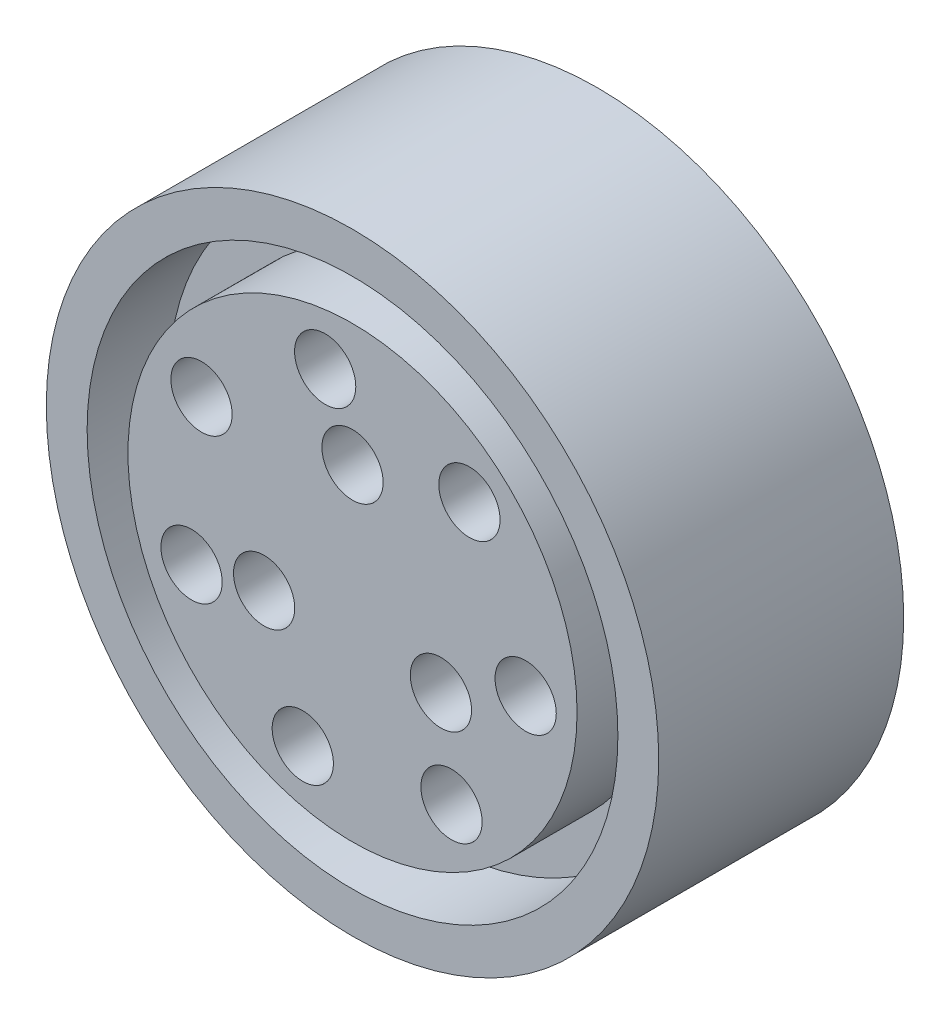
ISO-10303-21;
HEADER;
FILE_DESCRIPTION(('STEP AP214'),'2;1');
FILE_NAME('part.step','',(''),(''),'','','');
FILE_SCHEMA(('AUTOMOTIVE_DESIGN { 1 0 10303 214 1 1 1 1 }'));
ENDSEC;
DATA;
#1=APPLICATION_CONTEXT('core data for automotive mechanical design processes');
#2=APPLICATION_PROTOCOL_DEFINITION('international standard','automotive_design',2000,#1);
#3=PRODUCT_CONTEXT('',#1,'mechanical');
#4=PRODUCT('Part','Part','',(#3));
#5=PRODUCT_RELATED_PRODUCT_CATEGORY('part','',(#4));
#6=PRODUCT_DEFINITION_FORMATION('','',#4);
#7=PRODUCT_DEFINITION_CONTEXT('part definition',#1,'design');
#8=PRODUCT_DEFINITION('design','',#6,#7);
#9=PRODUCT_DEFINITION_SHAPE('','',#8);
#10=(LENGTH_UNIT() NAMED_UNIT(*) SI_UNIT(.MILLI.,.METRE.));
#11=(NAMED_UNIT(*) PLANE_ANGLE_UNIT() SI_UNIT($,.RADIAN.));
#12=(NAMED_UNIT(*) SI_UNIT($,.STERADIAN.) SOLID_ANGLE_UNIT());
#13=UNCERTAINTY_MEASURE_WITH_UNIT(LENGTH_MEASURE(1.E-05),#10,'distance_accuracy_value','');
#14=(GEOMETRIC_REPRESENTATION_CONTEXT(3) GLOBAL_UNCERTAINTY_ASSIGNED_CONTEXT((#13)) GLOBAL_UNIT_ASSIGNED_CONTEXT((#10,
#11,#12)) REPRESENTATION_CONTEXT('',''));
#15=CARTESIAN_POINT('',(0.,0.,0.));
#16=DIRECTION('',(0.,0.,1.));
#17=DIRECTION('',(1.,0.,0.));
#18=AXIS2_PLACEMENT_3D('',#15,#16,#17);
#19=CARTESIAN_POINT('',(-17.8440625583821,-1.91614094586654,6.));
#20=DIRECTION('',(0.,0.,-1.));
#21=DIRECTION('',(-1.,0.,0.));
#22=AXIS2_PLACEMENT_3D('',#19,#20,#21);
#23=CYLINDRICAL_SURFACE('',#22,7.5);
#24=CARTESIAN_POINT('',(-17.8440625583821,-1.91614094586654,6.));
#25=DIRECTION('',(0.,0.,1.));
#26=DIRECTION('',(1.,0.,0.));
#27=AXIS2_PLACEMENT_3D('',#24,#25,#26);
#28=CIRCLE('',#27,7.5);
#29=CARTESIAN_POINT('',(-10.3440625583821,-1.91614094586654,6.));
#30=VERTEX_POINT('',#29);
#31=EDGE_CURVE('E10',#30,#30,#28,.T.);
#32=ORIENTED_EDGE('',*,*,#31,.F.);
#33=EDGE_LOOP('',(#32));
#34=FACE_BOUND('',#33,.T.);
#35=CARTESIAN_POINT('',(-17.8440625583821,-1.91614094586654,0.));
#36=DIRECTION('',(0.,0.,1.));
#37=DIRECTION('',(1.,0.,0.));
#38=AXIS2_PLACEMENT_3D('',#35,#36,#37);
#39=CIRCLE('',#38,7.5);
#40=CARTESIAN_POINT('',(-10.3440625583821,-1.91614094586654,0.));
#41=VERTEX_POINT('',#40);
#42=EDGE_CURVE('E44',#41,#41,#39,.T.);
#43=ORIENTED_EDGE('',*,*,#42,.T.);
#44=EDGE_LOOP('',(#43));
#45=FACE_BOUND('',#44,.T.);
#46=ADVANCED_FACE('F41',(#34,#45),#23,.T.);
#47=CARTESIAN_POINT('',(-17.8440625583821,-1.91614094586654,6.));
#48=DIRECTION('',(0.,0.,1.));
#49=DIRECTION('',(1.,0.,0.));
#50=AXIS2_PLACEMENT_3D('',#47,#48,#49);
#51=PLANE('',#50);
#52=CARTESIAN_POINT('',(-17.8440625583821,-1.91614094586654,6.));
#53=DIRECTION('',(0.,0.,1.));
#54=DIRECTION('',(1.,0.,0.));
#55=AXIS2_PLACEMENT_3D('',#52,#53,#54);
#56=CIRCLE('',#55,6.5);
#57=CARTESIAN_POINT('',(-11.3440625583821,-1.91614094586654,6.));
#58=VERTEX_POINT('',#57);
#59=EDGE_CURVE('E55',#58,#58,#56,.T.);
#60=ORIENTED_EDGE('',*,*,#59,.F.);
#61=EDGE_LOOP('',(#60));
#62=FACE_BOUND('',#61,.T.);
#63=ORIENTED_EDGE('',*,*,#31,.T.);
#64=EDGE_LOOP('',(#63));
#65=FACE_BOUND('',#64,.T.);
#66=ADVANCED_FACE('F160',(#62,#65),#51,.T.);
#67=CARTESIAN_POINT('',(-17.8440625583821,-1.91614094586654,0.));
#68=DIRECTION('',(0.,0.,1.));
#69=DIRECTION('',(1.,0.,0.));
#70=AXIS2_PLACEMENT_3D('',#67,#68,#69);
#71=PLANE('',#70);
#72=ORIENTED_EDGE('',*,*,#42,.F.);
#73=EDGE_LOOP('',(#72));
#74=FACE_BOUND('',#73,.T.);
#75=ADVANCED_FACE('F181',(#74),#71,.F.);
#76=CARTESIAN_POINT('',(-17.8440625583821,-1.91614094586654,4.));
#77=DIRECTION('',(0.,0.,1.));
#78=DIRECTION('',(1.,0.,0.));
#79=AXIS2_PLACEMENT_3D('',#76,#77,#78);
#80=CYLINDRICAL_SURFACE('',#79,6.5);
#81=CARTESIAN_POINT('',(-17.8440625583821,-1.91614094586654,4.));
#82=DIRECTION('',(0.,0.,1.));
#83=DIRECTION('',(1.,0.,0.));
#84=AXIS2_PLACEMENT_3D('',#81,#82,#83);
#85=CIRCLE('',#84,6.5);
#86=CARTESIAN_POINT('',(-11.3440625583821,-1.91614094586654,4.));
#87=VERTEX_POINT('',#86);
#88=EDGE_CURVE('E53',#87,#87,#85,.T.);
#89=ORIENTED_EDGE('',*,*,#88,.F.);
#90=EDGE_LOOP('',(#89));
#91=FACE_BOUND('',#90,.T.);
#92=ORIENTED_EDGE('',*,*,#59,.T.);
#93=EDGE_LOOP('',(#92));
#94=FACE_BOUND('',#93,.T.);
#95=ADVANCED_FACE('F172',(#91,#94),#80,.F.);
#96=CARTESIAN_POINT('',(-17.8440625583821,-1.91614094586654,4.));
#97=DIRECTION('',(0.,0.,1.));
#98=DIRECTION('',(1.,0.,0.));
#99=AXIS2_PLACEMENT_3D('',#96,#97,#98);
#100=PLANE('',#99);
#101=CARTESIAN_POINT('',(-17.8440625583821,-1.91614094586654,4.));
#102=DIRECTION('',(0.,0.,1.));
#103=DIRECTION('',(1.,0.,0.));
#104=AXIS2_PLACEMENT_3D('',#101,#102,#103);
#105=CIRCLE('',#104,5.5);
#106=CARTESIAN_POINT('',(-12.3440625583821,-1.91614094586654,4.));
#107=VERTEX_POINT('',#106);
#108=EDGE_CURVE('E59',#107,#107,#105,.T.);
#109=ORIENTED_EDGE('',*,*,#108,.F.);
#110=EDGE_LOOP('',(#109));
#111=FACE_BOUND('',#110,.T.);
#112=ORIENTED_EDGE('',*,*,#88,.T.);
#113=EDGE_LOOP('',(#112));
#114=FACE_BOUND('',#113,.T.);
#115=ADVANCED_FACE('F166',(#111,#114),#100,.T.);
#116=CARTESIAN_POINT('',(-17.8440625583821,-1.91614094586654,4.));
#117=DIRECTION('',(0.,0.,1.));
#118=DIRECTION('',(1.,0.,0.));
#119=AXIS2_PLACEMENT_3D('',#116,#117,#118);
#120=CYLINDRICAL_SURFACE('',#119,5.5);
#121=ORIENTED_EDGE('',*,*,#108,.T.);
#122=EDGE_LOOP('',(#121));
#123=FACE_BOUND('',#122,.T.);
#124=CARTESIAN_POINT('',(-17.8440625583821,-1.91614094586654,6.));
#125=DIRECTION('',(0.,0.,1.));
#126=DIRECTION('',(1.,0.,0.));
#127=AXIS2_PLACEMENT_3D('',#124,#125,#126);
#128=CIRCLE('',#127,5.5);
#129=CARTESIAN_POINT('',(-12.3440625583821,-1.91614094586654,6.));
#130=VERTEX_POINT('',#129);
#131=EDGE_CURVE('E63',#130,#130,#128,.T.);
#132=ORIENTED_EDGE('',*,*,#131,.F.);
#133=EDGE_LOOP('',(#132));
#134=FACE_BOUND('',#133,.T.);
#135=ADVANCED_FACE('F157',(#123,#134),#120,.T.);
#136=CARTESIAN_POINT('',(-19.0617817430837,-5.98795380836497,6.));
#137=DIRECTION('',(0.,0.,1.));
#138=DIRECTION('',(1.,0.,0.));
#139=AXIS2_PLACEMENT_3D('',#136,#137,#138);
#140=CIRCLE('',#139,0.75);
#141=CARTESIAN_POINT('',(-18.3117817430837,-5.98795380836497,6.));
#142=VERTEX_POINT('',#141);
#143=EDGE_CURVE('E115',#142,#142,#140,.T.);
#144=ORIENTED_EDGE('',*,*,#143,.F.);
#145=EDGE_LOOP('',(#144));
#146=FACE_BOUND('',#145,.T.);
#147=CARTESIAN_POINT('',(-15.4198265649516,-5.40692593611656,6.));
#148=DIRECTION('',(0.,0.,1.));
#149=DIRECTION('',(1.,0.,0.));
#150=AXIS2_PLACEMENT_3D('',#147,#148,#149);
#151=CIRCLE('',#150,0.750000000000004);
#152=CARTESIAN_POINT('',(-14.6698265649516,-5.40692593611656,6.));
#153=VERTEX_POINT('',#152);
#154=EDGE_CURVE('E124',#153,#153,#151,.T.);
#155=ORIENTED_EDGE('',*,*,#154,.F.);
#156=EDGE_LOOP('',(#155));
#157=FACE_BOUND('',#156,.T.);
#158=CARTESIAN_POINT('',(-13.6033705352748,-2.19726576717279,6.));
#159=DIRECTION('',(0.,0.,1.));
#160=DIRECTION('',(1.,0.,0.));
#161=AXIS2_PLACEMENT_3D('',#158,#159,#160);
#162=CIRCLE('',#161,0.750000000000002);
#163=CARTESIAN_POINT('',(-12.8533705352748,-2.19726576717279,6.));
#164=VERTEX_POINT('',#163);
#165=EDGE_CURVE('E132',#164,#164,#162,.T.);
#166=ORIENTED_EDGE('',*,*,#165,.F.);
#167=EDGE_LOOP('',(#166));
#168=FACE_BOUND('',#167,.T.);
#169=CARTESIAN_POINT('',(-14.9802420933504,1.22408712611603,6.));
#170=DIRECTION('',(0.,0.,1.));
#171=DIRECTION('',(1.,0.,0.));
#172=AXIS2_PLACEMENT_3D('',#169,#170,#171);
#173=CIRCLE('',#172,0.750000000000001);
#174=CARTESIAN_POINT('',(-14.2302420933504,1.22408712611603,6.));
#175=VERTEX_POINT('',#174);
#176=EDGE_CURVE('E84',#175,#175,#173,.T.);
#177=ORIENTED_EDGE('',*,*,#176,.F.);
#178=EDGE_LOOP('',(#177));
#179=FACE_BOUND('',#178,.T.);
#180=CARTESIAN_POINT('',(-18.5136288728862,2.28078423222314,6.));
#181=DIRECTION('',(0.,0.,1.));
#182=DIRECTION('',(1.,0.,0.));
#183=AXIS2_PLACEMENT_3D('',#180,#181,#182);
#184=CIRCLE('',#183,0.750000000000004);
#185=CARTESIAN_POINT('',(-17.7636288728862,2.28078423222314,6.));
#186=VERTEX_POINT('',#185);
#187=EDGE_CURVE('E83',#186,#186,#184,.T.);
#188=ORIENTED_EDGE('',*,*,#187,.F.);
#189=EDGE_LOOP('',(#188));
#190=FACE_BOUND('',#189,.T.);
#191=CARTESIAN_POINT('',(-21.5428185609366,0.177111077557168,6.));
#192=DIRECTION('',(0.,0.,1.));
#193=DIRECTION('',(1.,0.,0.));
#194=AXIS2_PLACEMENT_3D('',#191,#192,#193);
#195=CIRCLE('',#194,0.750000000000002);
#196=CARTESIAN_POINT('',(-20.7928185609366,0.177111077557168,6.));
#197=VERTEX_POINT('',#196);
#198=EDGE_CURVE('E92',#197,#197,#195,.T.);
#199=ORIENTED_EDGE('',*,*,#198,.F.);
#200=EDGE_LOOP('',(#199));
#201=FACE_BOUND('',#200,.T.);
#202=CARTESIAN_POINT('',(-20.0091260678432,-3.16614094586655,6.));
#203=DIRECTION('',(0.,0.,1.));
#204=DIRECTION('',(1.,0.,0.));
#205=AXIS2_PLACEMENT_3D('',#202,#203,#204);
#206=CIRCLE('',#205,0.750000000000002);
#207=CARTESIAN_POINT('',(-19.2591260678432,-3.16614094586655,6.));
#208=VERTEX_POINT('',#207);
#209=EDGE_CURVE('E100',#208,#208,#206,.T.);
#210=ORIENTED_EDGE('',*,*,#209,.F.);
#211=EDGE_LOOP('',(#210));
#212=FACE_BOUND('',#211,.T.);
#213=CARTESIAN_POINT('',(-15.6789990489211,-3.16614094586655,6.));
#214=DIRECTION('',(0.,0.,1.));
#215=DIRECTION('',(1.,0.,0.));
#216=AXIS2_PLACEMENT_3D('',#213,#214,#215);
#217=CIRCLE('',#216,0.75);
#218=CARTESIAN_POINT('',(-14.9289990489211,-3.16614094586655,6.));
#219=VERTEX_POINT('',#218);
#220=EDGE_CURVE('E75',#219,#219,#217,.T.);
#221=ORIENTED_EDGE('',*,*,#220,.F.);
#222=EDGE_LOOP('',(#221));
#223=FACE_BOUND('',#222,.T.);
#224=CARTESIAN_POINT('',(-21.786769538191,-3.50282354530633,6.));
#225=DIRECTION('',(0.,0.,1.));
#226=DIRECTION('',(1.,0.,0.));
#227=AXIS2_PLACEMENT_3D('',#224,#225,#226);
#228=CIRCLE('',#227,0.749999999999999);
#229=CARTESIAN_POINT('',(-21.036769538191,-3.50282354530633,6.));
#230=VERTEX_POINT('',#229);
#231=EDGE_CURVE('E116',#230,#230,#228,.T.);
#232=ORIENTED_EDGE('',*,*,#231,.F.);
#233=EDGE_LOOP('',(#232));
#234=FACE_BOUND('',#233,.T.);
#235=CARTESIAN_POINT('',(-17.8440625583821,0.58385905413346,6.));
#236=DIRECTION('',(0.,0.,1.));
#237=DIRECTION('',(1.,0.,0.));
#238=AXIS2_PLACEMENT_3D('',#235,#236,#237);
#239=CIRCLE('',#238,0.750000000000002);
#240=CARTESIAN_POINT('',(-17.0940625583821,0.58385905413346,6.));
#241=VERTEX_POINT('',#240);
#242=EDGE_CURVE('E71',#241,#241,#239,.T.);
#243=ORIENTED_EDGE('',*,*,#242,.F.);
#244=EDGE_LOOP('',(#243));
#245=FACE_BOUND('',#244,.T.);
#246=ORIENTED_EDGE('',*,*,#131,.T.);
#247=EDGE_LOOP('',(#246));
#248=FACE_BOUND('',#247,.T.);
#249=ADVANCED_FACE('F153',(#146,#157,#168,#179,#190,#201,#212,#223,#234,#245,#248),#51,.T.);
#250=CARTESIAN_POINT('',(-17.8440625583821,0.58385905413346,4.));
#251=DIRECTION('',(0.,0.,1.));
#252=DIRECTION('',(1.,0.,0.));
#253=AXIS2_PLACEMENT_3D('',#250,#251,#252);
#254=CYLINDRICAL_SURFACE('',#253,0.750000000000002);
#255=CARTESIAN_POINT('',(-17.8440625583821,0.58385905413346,4.));
#256=DIRECTION('',(0.,0.,1.));
#257=DIRECTION('',(1.,0.,0.));
#258=AXIS2_PLACEMENT_3D('',#255,#256,#257);
#259=CIRCLE('',#258,0.750000000000002);
#260=CARTESIAN_POINT('',(-17.0940625583821,0.58385905413346,4.));
#261=VERTEX_POINT('',#260);
#262=EDGE_CURVE('E67',#261,#261,#259,.T.);
#263=ORIENTED_EDGE('',*,*,#262,.F.);
#264=EDGE_LOOP('',(#263));
#265=FACE_BOUND('',#264,.T.);
#266=ORIENTED_EDGE('',*,*,#242,.T.);
#267=EDGE_LOOP('',(#266));
#268=FACE_BOUND('',#267,.T.);
#269=ADVANCED_FACE('F156',(#265,#268),#254,.F.);
#270=CARTESIAN_POINT('',(-17.8440625583821,0.58385905413346,4.));
#271=DIRECTION('',(0.,0.,1.));
#272=DIRECTION('',(1.,0.,0.));
#273=AXIS2_PLACEMENT_3D('',#270,#271,#272);
#274=PLANE('',#273);
#275=ORIENTED_EDGE('',*,*,#262,.T.);
#276=EDGE_LOOP('',(#275));
#277=FACE_BOUND('',#276,.T.);
#278=ADVANCED_FACE('F226',(#277),#274,.T.);
#279=CARTESIAN_POINT('',(-21.786769538191,-3.50282354530633,4.));
#280=DIRECTION('',(0.,0.,1.));
#281=DIRECTION('',(1.,0.,0.));
#282=AXIS2_PLACEMENT_3D('',#279,#280,#281);
#283=CYLINDRICAL_SURFACE('',#282,0.749999999999999);
#284=CARTESIAN_POINT('',(-21.786769538191,-3.50282354530633,4.));
#285=DIRECTION('',(0.,0.,1.));
#286=DIRECTION('',(1.,0.,0.));
#287=AXIS2_PLACEMENT_3D('',#284,#285,#286);
#288=CIRCLE('',#287,0.749999999999999);
#289=CARTESIAN_POINT('',(-21.036769538191,-3.50282354530633,4.));
#290=VERTEX_POINT('',#289);
#291=EDGE_CURVE('E143',#290,#290,#288,.T.);
#292=ORIENTED_EDGE('',*,*,#291,.F.);
#293=EDGE_LOOP('',(#292));
#294=FACE_BOUND('',#293,.T.);
#295=ORIENTED_EDGE('',*,*,#231,.T.);
#296=EDGE_LOOP('',(#295));
#297=FACE_BOUND('',#296,.T.);
#298=ADVANCED_FACE('F151',(#294,#297),#283,.F.);
#299=CARTESIAN_POINT('',(-21.786769538191,-3.50282354530633,4.));
#300=DIRECTION('',(0.,0.,1.));
#301=DIRECTION('',(1.,0.,0.));
#302=AXIS2_PLACEMENT_3D('',#299,#300,#301);
#303=PLANE('',#302);
#304=ORIENTED_EDGE('',*,*,#291,.T.);
#305=EDGE_LOOP('',(#304));
#306=FACE_BOUND('',#305,.T.);
#307=ADVANCED_FACE('F246',(#306),#303,.T.);
#308=CARTESIAN_POINT('',(-15.6789990489211,-3.16614094586655,4.));
#309=DIRECTION('',(0.,0.,1.));
#310=DIRECTION('',(1.,0.,0.));
#311=AXIS2_PLACEMENT_3D('',#308,#309,#310);
#312=CYLINDRICAL_SURFACE('',#311,0.75);
#313=CARTESIAN_POINT('',(-15.6789990489211,-3.16614094586655,4.));
#314=DIRECTION('',(0.,0.,1.));
#315=DIRECTION('',(1.,0.,0.));
#316=AXIS2_PLACEMENT_3D('',#313,#314,#315);
#317=CIRCLE('',#316,0.75);
#318=CARTESIAN_POINT('',(-14.9289990489211,-3.16614094586655,4.));
#319=VERTEX_POINT('',#318);
#320=EDGE_CURVE('E104',#319,#319,#317,.T.);
#321=ORIENTED_EDGE('',*,*,#320,.F.);
#322=EDGE_LOOP('',(#321));
#323=FACE_BOUND('',#322,.T.);
#324=ORIENTED_EDGE('',*,*,#220,.T.);
#325=EDGE_LOOP('',(#324));
#326=FACE_BOUND('',#325,.T.);
#327=ADVANCED_FACE('F257',(#323,#326),#312,.F.);
#328=CARTESIAN_POINT('',(-15.6789990489211,-3.16614094586655,4.));
#329=DIRECTION('',(0.,0.,1.));
#330=DIRECTION('',(1.,0.,0.));
#331=AXIS2_PLACEMENT_3D('',#328,#329,#330);
#332=PLANE('',#331);
#333=ORIENTED_EDGE('',*,*,#320,.T.);
#334=EDGE_LOOP('',(#333));
#335=FACE_BOUND('',#334,.T.);
#336=ADVANCED_FACE('F268',(#335),#332,.T.);
#337=CARTESIAN_POINT('',(-20.0091260678432,-3.16614094586655,4.));
#338=DIRECTION('',(0.,0.,1.));
#339=DIRECTION('',(1.,0.,0.));
#340=AXIS2_PLACEMENT_3D('',#337,#338,#339);
#341=CYLINDRICAL_SURFACE('',#340,0.750000000000002);
#342=CARTESIAN_POINT('',(-20.0091260678432,-3.16614094586655,4.));
#343=DIRECTION('',(0.,0.,1.));
#344=DIRECTION('',(1.,0.,0.));
#345=AXIS2_PLACEMENT_3D('',#342,#343,#344);
#346=CIRCLE('',#345,0.750000000000002);
#347=CARTESIAN_POINT('',(-19.2591260678432,-3.16614094586655,4.));
#348=VERTEX_POINT('',#347);
#349=EDGE_CURVE('E96',#348,#348,#346,.T.);
#350=ORIENTED_EDGE('',*,*,#349,.F.);
#351=EDGE_LOOP('',(#350));
#352=FACE_BOUND('',#351,.T.);
#353=ORIENTED_EDGE('',*,*,#209,.T.);
#354=EDGE_LOOP('',(#353));
#355=FACE_BOUND('',#354,.T.);
#356=ADVANCED_FACE('F279',(#352,#355),#341,.F.);
#357=CARTESIAN_POINT('',(-20.0091260678432,-3.16614094586655,4.));
#358=DIRECTION('',(0.,0.,1.));
#359=DIRECTION('',(1.,0.,0.));
#360=AXIS2_PLACEMENT_3D('',#357,#358,#359);
#361=PLANE('',#360);
#362=ORIENTED_EDGE('',*,*,#349,.T.);
#363=EDGE_LOOP('',(#362));
#364=FACE_BOUND('',#363,.T.);
#365=ADVANCED_FACE('F290',(#364),#361,.T.);
#366=CARTESIAN_POINT('',(-21.5428185609366,0.177111077557168,4.));
#367=DIRECTION('',(0.,0.,1.));
#368=DIRECTION('',(1.,0.,0.));
#369=AXIS2_PLACEMENT_3D('',#366,#367,#368);
#370=CYLINDRICAL_SURFACE('',#369,0.750000000000002);
#371=CARTESIAN_POINT('',(-21.5428185609366,0.177111077557168,4.));
#372=DIRECTION('',(0.,0.,1.));
#373=DIRECTION('',(1.,0.,0.));
#374=AXIS2_PLACEMENT_3D('',#371,#372,#373);
#375=CIRCLE('',#374,0.750000000000002);
#376=CARTESIAN_POINT('',(-20.7928185609366,0.177111077557168,4.));
#377=VERTEX_POINT('',#376);
#378=EDGE_CURVE('E88',#377,#377,#375,.T.);
#379=ORIENTED_EDGE('',*,*,#378,.F.);
#380=EDGE_LOOP('',(#379));
#381=FACE_BOUND('',#380,.T.);
#382=ORIENTED_EDGE('',*,*,#198,.T.);
#383=EDGE_LOOP('',(#382));
#384=FACE_BOUND('',#383,.T.);
#385=ADVANCED_FACE('F301',(#381,#384),#370,.F.);
#386=CARTESIAN_POINT('',(-21.5428185609366,0.177111077557168,4.));
#387=DIRECTION('',(0.,0.,1.));
#388=DIRECTION('',(1.,0.,0.));
#389=AXIS2_PLACEMENT_3D('',#386,#387,#388);
#390=PLANE('',#389);
#391=ORIENTED_EDGE('',*,*,#378,.T.);
#392=EDGE_LOOP('',(#391));
#393=FACE_BOUND('',#392,.T.);
#394=ADVANCED_FACE('F312',(#393),#390,.T.);
#395=CARTESIAN_POINT('',(-18.5136288728862,2.28078423222314,4.));
#396=DIRECTION('',(0.,0.,1.));
#397=DIRECTION('',(1.,0.,0.));
#398=AXIS2_PLACEMENT_3D('',#395,#396,#397);
#399=CYLINDRICAL_SURFACE('',#398,0.750000000000004);
#400=CARTESIAN_POINT('',(-18.5136288728862,2.28078423222314,4.));
#401=DIRECTION('',(0.,0.,1.));
#402=DIRECTION('',(1.,0.,0.));
#403=AXIS2_PLACEMENT_3D('',#400,#401,#402);
#404=CIRCLE('',#403,0.750000000000004);
#405=CARTESIAN_POINT('',(-17.7636288728862,2.28078423222314,4.));
#406=VERTEX_POINT('',#405);
#407=EDGE_CURVE('E79',#406,#406,#404,.T.);
#408=ORIENTED_EDGE('',*,*,#407,.F.);
#409=EDGE_LOOP('',(#408));
#410=FACE_BOUND('',#409,.T.);
#411=ORIENTED_EDGE('',*,*,#187,.T.);
#412=EDGE_LOOP('',(#411));
#413=FACE_BOUND('',#412,.T.);
#414=ADVANCED_FACE('F323',(#410,#413),#399,.F.);
#415=CARTESIAN_POINT('',(-18.5136288728862,2.28078423222314,4.));
#416=DIRECTION('',(0.,0.,1.));
#417=DIRECTION('',(1.,0.,0.));
#418=AXIS2_PLACEMENT_3D('',#415,#416,#417);
#419=PLANE('',#418);
#420=ORIENTED_EDGE('',*,*,#407,.T.);
#421=EDGE_LOOP('',(#420));
#422=FACE_BOUND('',#421,.T.);
#423=ADVANCED_FACE('F334',(#422),#419,.T.);
#424=CARTESIAN_POINT('',(-14.9802420933504,1.22408712611603,4.));
#425=DIRECTION('',(0.,0.,1.));
#426=DIRECTION('',(1.,0.,0.));
#427=AXIS2_PLACEMENT_3D('',#424,#425,#426);
#428=CYLINDRICAL_SURFACE('',#427,0.750000000000001);
#429=CARTESIAN_POINT('',(-14.9802420933504,1.22408712611603,4.));
#430=DIRECTION('',(0.,0.,1.));
#431=DIRECTION('',(1.,0.,0.));
#432=AXIS2_PLACEMENT_3D('',#429,#430,#431);
#433=CIRCLE('',#432,0.750000000000001);
#434=CARTESIAN_POINT('',(-14.2302420933504,1.22408712611603,4.));
#435=VERTEX_POINT('',#434);
#436=EDGE_CURVE('E136',#435,#435,#433,.T.);
#437=ORIENTED_EDGE('',*,*,#436,.F.);
#438=EDGE_LOOP('',(#437));
#439=FACE_BOUND('',#438,.T.);
#440=ORIENTED_EDGE('',*,*,#176,.T.);
#441=EDGE_LOOP('',(#440));
#442=FACE_BOUND('',#441,.T.);
#443=ADVANCED_FACE('F345',(#439,#442),#428,.F.);
#444=CARTESIAN_POINT('',(-14.9802420933504,1.22408712611603,4.));
#445=DIRECTION('',(0.,0.,1.));
#446=DIRECTION('',(1.,0.,0.));
#447=AXIS2_PLACEMENT_3D('',#444,#445,#446);
#448=PLANE('',#447);
#449=ORIENTED_EDGE('',*,*,#436,.T.);
#450=EDGE_LOOP('',(#449));
#451=FACE_BOUND('',#450,.T.);
#452=ADVANCED_FACE('F356',(#451),#448,.T.);
#453=CARTESIAN_POINT('',(-13.6033705352748,-2.19726576717279,4.));
#454=DIRECTION('',(0.,0.,1.));
#455=DIRECTION('',(1.,0.,0.));
#456=AXIS2_PLACEMENT_3D('',#453,#454,#455);
#457=CYLINDRICAL_SURFACE('',#456,0.750000000000002);
#458=CARTESIAN_POINT('',(-13.6033705352748,-2.19726576717279,4.));
#459=DIRECTION('',(0.,0.,1.));
#460=DIRECTION('',(1.,0.,0.));
#461=AXIS2_PLACEMENT_3D('',#458,#459,#460);
#462=CIRCLE('',#461,0.750000000000002);
#463=CARTESIAN_POINT('',(-12.8533705352748,-2.19726576717279,4.));
#464=VERTEX_POINT('',#463);
#465=EDGE_CURVE('E128',#464,#464,#462,.T.);
#466=ORIENTED_EDGE('',*,*,#465,.F.);
#467=EDGE_LOOP('',(#466));
#468=FACE_BOUND('',#467,.T.);
#469=ORIENTED_EDGE('',*,*,#165,.T.);
#470=EDGE_LOOP('',(#469));
#471=FACE_BOUND('',#470,.T.);
#472=ADVANCED_FACE('F367',(#468,#471),#457,.F.);
#473=CARTESIAN_POINT('',(-13.6033705352748,-2.19726576717279,4.));
#474=DIRECTION('',(0.,0.,1.));
#475=DIRECTION('',(1.,0.,0.));
#476=AXIS2_PLACEMENT_3D('',#473,#474,#475);
#477=PLANE('',#476);
#478=ORIENTED_EDGE('',*,*,#465,.T.);
#479=EDGE_LOOP('',(#478));
#480=FACE_BOUND('',#479,.T.);
#481=ADVANCED_FACE('F378',(#480),#477,.T.);
#482=CARTESIAN_POINT('',(-15.4198265649516,-5.40692593611656,4.));
#483=DIRECTION('',(0.,0.,1.));
#484=DIRECTION('',(1.,0.,0.));
#485=AXIS2_PLACEMENT_3D('',#482,#483,#484);
#486=CYLINDRICAL_SURFACE('',#485,0.750000000000004);
#487=CARTESIAN_POINT('',(-15.4198265649516,-5.40692593611656,4.));
#488=DIRECTION('',(0.,0.,1.));
#489=DIRECTION('',(1.,0.,0.));
#490=AXIS2_PLACEMENT_3D('',#487,#488,#489);
#491=CIRCLE('',#490,0.750000000000004);
#492=CARTESIAN_POINT('',(-14.6698265649516,-5.40692593611656,4.));
#493=VERTEX_POINT('',#492);
#494=EDGE_CURVE('E120',#493,#493,#491,.T.);
#495=ORIENTED_EDGE('',*,*,#494,.F.);
#496=EDGE_LOOP('',(#495));
#497=FACE_BOUND('',#496,.T.);
#498=ORIENTED_EDGE('',*,*,#154,.T.);
#499=EDGE_LOOP('',(#498));
#500=FACE_BOUND('',#499,.T.);
#501=ADVANCED_FACE('F389',(#497,#500),#486,.F.);
#502=CARTESIAN_POINT('',(-15.4198265649516,-5.40692593611656,4.));
#503=DIRECTION('',(0.,0.,1.));
#504=DIRECTION('',(1.,0.,0.));
#505=AXIS2_PLACEMENT_3D('',#502,#503,#504);
#506=PLANE('',#505);
#507=ORIENTED_EDGE('',*,*,#494,.T.);
#508=EDGE_LOOP('',(#507));
#509=FACE_BOUND('',#508,.T.);
#510=ADVANCED_FACE('F400',(#509),#506,.T.);
#511=CARTESIAN_POINT('',(-19.0617817430837,-5.98795380836497,4.));
#512=DIRECTION('',(0.,0.,1.));
#513=DIRECTION('',(1.,0.,0.));
#514=AXIS2_PLACEMENT_3D('',#511,#512,#513);
#515=CYLINDRICAL_SURFACE('',#514,0.75);
#516=CARTESIAN_POINT('',(-19.0617817430837,-5.98795380836497,4.));
#517=DIRECTION('',(0.,0.,1.));
#518=DIRECTION('',(1.,0.,0.));
#519=AXIS2_PLACEMENT_3D('',#516,#517,#518);
#520=CIRCLE('',#519,0.75);
#521=CARTESIAN_POINT('',(-18.3117817430837,-5.98795380836497,4.));
#522=VERTEX_POINT('',#521);
#523=EDGE_CURVE('E111',#522,#522,#520,.T.);
#524=ORIENTED_EDGE('',*,*,#523,.F.);
#525=EDGE_LOOP('',(#524));
#526=FACE_BOUND('',#525,.T.);
#527=ORIENTED_EDGE('',*,*,#143,.T.);
#528=EDGE_LOOP('',(#527));
#529=FACE_BOUND('',#528,.T.);
#530=ADVANCED_FACE('F411',(#526,#529),#515,.F.);
#531=CARTESIAN_POINT('',(-19.0617817430837,-5.98795380836497,4.));
#532=DIRECTION('',(0.,0.,1.));
#533=DIRECTION('',(1.,0.,0.));
#534=AXIS2_PLACEMENT_3D('',#531,#532,#533);
#535=PLANE('',#534);
#536=ORIENTED_EDGE('',*,*,#523,.T.);
#537=EDGE_LOOP('',(#536));
#538=FACE_BOUND('',#537,.T.);
#539=ADVANCED_FACE('F422',(#538),#535,.T.);
#540=CLOSED_SHELL('',(#46,#66,#75,#95,#115,#135,#249,#269,#278,#298,#307,#327,#336,#356,#365,
#385,#394,#414,#423,#443,#452,#472,#481,#501,#510,#530,#539));
#541=MANIFOLD_SOLID_BREP('B2',#540);
#542=ADVANCED_BREP_SHAPE_REPRESENTATION('',(#18,#541),#14);
#543=SHAPE_DEFINITION_REPRESENTATION(#9,#542);
ENDSEC;
END-ISO-10303-21;
